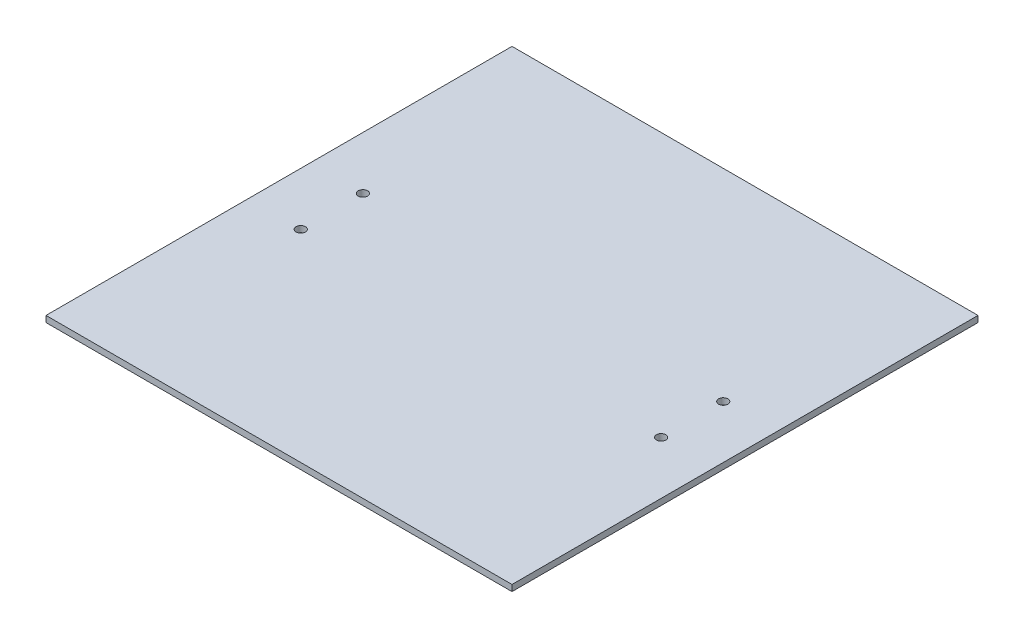
ISO-10303-21;
HEADER;
FILE_DESCRIPTION(('STEP AP214'),'2;1');
FILE_NAME('part.step','',(''),(''),'','','');
FILE_SCHEMA(('AUTOMOTIVE_DESIGN { 1 0 10303 214 1 1 1 1 }'));
ENDSEC;
DATA;
#1=APPLICATION_CONTEXT('core data for automotive mechanical design processes');
#2=APPLICATION_PROTOCOL_DEFINITION('international standard','automotive_design',2000,#1);
#3=PRODUCT_CONTEXT('',#1,'mechanical');
#4=PRODUCT('Part','Part','',(#3));
#5=PRODUCT_RELATED_PRODUCT_CATEGORY('part','',(#4));
#6=PRODUCT_DEFINITION_FORMATION('','',#4);
#7=PRODUCT_DEFINITION_CONTEXT('part definition',#1,'design');
#8=PRODUCT_DEFINITION('design','',#6,#7);
#9=PRODUCT_DEFINITION_SHAPE('','',#8);
#10=(LENGTH_UNIT() NAMED_UNIT(*) SI_UNIT(.MILLI.,.METRE.));
#11=(NAMED_UNIT(*) PLANE_ANGLE_UNIT() SI_UNIT($,.RADIAN.));
#12=(NAMED_UNIT(*) SI_UNIT($,.STERADIAN.) SOLID_ANGLE_UNIT());
#13=UNCERTAINTY_MEASURE_WITH_UNIT(LENGTH_MEASURE(1.E-05),#10,'distance_accuracy_value','');
#14=(GEOMETRIC_REPRESENTATION_CONTEXT(3) GLOBAL_UNCERTAINTY_ASSIGNED_CONTEXT((#13)) GLOBAL_UNIT_ASSIGNED_CONTEXT((#10,
#11,#12)) REPRESENTATION_CONTEXT('',''));
#15=CARTESIAN_POINT('',(0.,0.,0.));
#16=DIRECTION('',(0.,0.,1.));
#17=DIRECTION('',(1.,0.,0.));
#18=AXIS2_PLACEMENT_3D('',#15,#16,#17);
#19=CARTESIAN_POINT('',(0.,2.,0.));
#20=DIRECTION('',(0.,0.,-1.));
#21=DIRECTION('',(-1.,0.,0.));
#22=AXIS2_PLACEMENT_3D('',#19,#20,#21);
#23=PLANE('',#22);
#24=DIRECTION('',(1.,0.,0.));
#25=VECTOR('',#24,1.);
#26=CARTESIAN_POINT('',(0.,0.,0.));
#27=LINE('',#26,#25);
#28=CARTESIAN_POINT('',(0.,0.,0.));
#29=VERTEX_POINT('',#28);
#30=CARTESIAN_POINT('',(150.,0.,0.));
#31=VERTEX_POINT('',#30);
#32=EDGE_CURVE('E113',#29,#31,#27,.T.);
#33=ORIENTED_EDGE('',*,*,#32,.T.);
#34=DIRECTION('',(0.,-1.,0.));
#35=VECTOR('',#34,1.);
#36=CARTESIAN_POINT('',(150.,2.,0.));
#37=LINE('',#36,#35);
#38=CARTESIAN_POINT('',(150.,2.,0.));
#39=VERTEX_POINT('',#38);
#40=EDGE_CURVE('E11',#39,#31,#37,.T.);
#41=ORIENTED_EDGE('',*,*,#40,.F.);
#42=DIRECTION('',(1.,0.,0.));
#43=VECTOR('',#42,1.);
#44=CARTESIAN_POINT('',(0.,2.,0.));
#45=LINE('',#44,#43);
#46=CARTESIAN_POINT('',(0.,2.,0.));
#47=VERTEX_POINT('',#46);
#48=EDGE_CURVE('E87',#47,#39,#45,.T.);
#49=ORIENTED_EDGE('',*,*,#48,.F.);
#50=DIRECTION('',(0.,-1.,0.));
#51=VECTOR('',#50,1.);
#52=CARTESIAN_POINT('',(0.,2.,0.));
#53=LINE('',#52,#51);
#54=EDGE_CURVE('E54',#47,#29,#53,.T.);
#55=ORIENTED_EDGE('',*,*,#54,.T.);
#56=EDGE_LOOP('',(#33,#41,#49,#55));
#57=FACE_BOUND('',#56,.T.);
#58=ADVANCED_FACE('F37',(#57),#23,.F.);
#59=CARTESIAN_POINT('',(150.,2.,0.));
#60=DIRECTION('',(-1.,0.,0.));
#61=DIRECTION('',(0.,0.,1.));
#62=AXIS2_PLACEMENT_3D('',#59,#60,#61);
#63=PLANE('',#62);
#64=DIRECTION('',(0.,0.,-1.));
#65=VECTOR('',#64,1.);
#66=CARTESIAN_POINT('',(150.,0.,0.));
#67=LINE('',#66,#65);
#68=CARTESIAN_POINT('',(150.,0.,-150.));
#69=VERTEX_POINT('',#68);
#70=EDGE_CURVE('E92',#31,#69,#67,.T.);
#71=ORIENTED_EDGE('',*,*,#70,.T.);
#72=DIRECTION('',(0.,-1.,0.));
#73=VECTOR('',#72,1.);
#74=CARTESIAN_POINT('',(150.,2.,-150.));
#75=LINE('',#74,#73);
#76=CARTESIAN_POINT('',(150.,2.,-150.));
#77=VERTEX_POINT('',#76);
#78=EDGE_CURVE('E46',#77,#69,#75,.T.);
#79=ORIENTED_EDGE('',*,*,#78,.F.);
#80=DIRECTION('',(0.,0.,-1.));
#81=VECTOR('',#80,1.);
#82=CARTESIAN_POINT('',(150.,2.,0.));
#83=LINE('',#82,#81);
#84=EDGE_CURVE('E79',#39,#77,#83,.T.);
#85=ORIENTED_EDGE('',*,*,#84,.F.);
#86=ORIENTED_EDGE('',*,*,#40,.T.);
#87=EDGE_LOOP('',(#71,#79,#85,#86));
#88=FACE_BOUND('',#87,.T.);
#89=ADVANCED_FACE('F91',(#88),#63,.F.);
#90=CARTESIAN_POINT('',(0.,2.,-150.));
#91=DIRECTION('',(0.,0.,-1.));
#92=DIRECTION('',(-1.,0.,0.));
#93=AXIS2_PLACEMENT_3D('',#90,#91,#92);
#94=PLANE('',#93);
#95=DIRECTION('',(1.,0.,0.));
#96=VECTOR('',#95,1.);
#97=CARTESIAN_POINT('',(0.,0.,-150.));
#98=LINE('',#97,#96);
#99=CARTESIAN_POINT('',(0.,0.,-150.));
#100=VERTEX_POINT('',#99);
#101=EDGE_CURVE('E116',#100,#69,#98,.T.);
#102=ORIENTED_EDGE('',*,*,#101,.F.);
#103=DIRECTION('',(0.,-1.,0.));
#104=VECTOR('',#103,1.);
#105=CARTESIAN_POINT('',(0.,2.,-150.));
#106=LINE('',#105,#104);
#107=CARTESIAN_POINT('',(0.,2.,-150.));
#108=VERTEX_POINT('',#107);
#109=EDGE_CURVE('E68',#108,#100,#106,.T.);
#110=ORIENTED_EDGE('',*,*,#109,.F.);
#111=DIRECTION('',(1.,0.,0.));
#112=VECTOR('',#111,1.);
#113=CARTESIAN_POINT('',(0.,2.,-150.));
#114=LINE('',#113,#112);
#115=EDGE_CURVE('E86',#108,#77,#114,.T.);
#116=ORIENTED_EDGE('',*,*,#115,.T.);
#117=ORIENTED_EDGE('',*,*,#78,.T.);
#118=EDGE_LOOP('',(#102,#110,#116,#117));
#119=FACE_BOUND('',#118,.T.);
#120=ADVANCED_FACE('F95',(#119),#94,.T.);
#121=CARTESIAN_POINT('',(17.,2.,-85.));
#122=DIRECTION('',(0.,-1.,0.));
#123=DIRECTION('',(0.,0.,-1.));
#124=AXIS2_PLACEMENT_3D('',#121,#122,#123);
#125=CYLINDRICAL_SURFACE('',#124,1.5);
#126=CARTESIAN_POINT('',(17.,2.,-85.));
#127=DIRECTION('',(0.,1.,0.));
#128=DIRECTION('',(0.,0.,1.));
#129=AXIS2_PLACEMENT_3D('',#126,#127,#128);
#130=CIRCLE('',#129,1.5);
#131=CARTESIAN_POINT('',(17.,2.,-83.5));
#132=VERTEX_POINT('',#131);
#133=EDGE_CURVE('E135',#132,#132,#130,.T.);
#134=ORIENTED_EDGE('',*,*,#133,.T.);
#135=EDGE_LOOP('',(#134));
#136=FACE_BOUND('',#135,.T.);
#137=CARTESIAN_POINT('',(17.,0.,-85.));
#138=DIRECTION('',(0.,1.,0.));
#139=DIRECTION('',(0.,0.,1.));
#140=AXIS2_PLACEMENT_3D('',#137,#138,#139);
#141=CIRCLE('',#140,1.5);
#142=CARTESIAN_POINT('',(17.,0.,-83.5));
#143=VERTEX_POINT('',#142);
#144=EDGE_CURVE('E110',#143,#143,#141,.T.);
#145=ORIENTED_EDGE('',*,*,#144,.F.);
#146=EDGE_LOOP('',(#145));
#147=FACE_BOUND('',#146,.T.);
#148=ADVANCED_FACE('F139',(#136,#147),#125,.F.);
#149=CARTESIAN_POINT('',(133.,2.,-85.));
#150=DIRECTION('',(0.,-1.,0.));
#151=DIRECTION('',(0.,0.,-1.));
#152=AXIS2_PLACEMENT_3D('',#149,#150,#151);
#153=CYLINDRICAL_SURFACE('',#152,1.50000000000003);
#154=CARTESIAN_POINT('',(133.,2.,-85.));
#155=DIRECTION('',(0.,1.,0.));
#156=DIRECTION('',(0.,0.,1.));
#157=AXIS2_PLACEMENT_3D('',#154,#155,#156);
#158=CIRCLE('',#157,1.50000000000003);
#159=CARTESIAN_POINT('',(133.,2.,-83.5));
#160=VERTEX_POINT('',#159);
#161=EDGE_CURVE('E130',#160,#160,#158,.T.);
#162=ORIENTED_EDGE('',*,*,#161,.T.);
#163=EDGE_LOOP('',(#162));
#164=FACE_BOUND('',#163,.T.);
#165=CARTESIAN_POINT('',(133.,0.,-85.));
#166=DIRECTION('',(0.,1.,0.));
#167=DIRECTION('',(0.,0.,1.));
#168=AXIS2_PLACEMENT_3D('',#165,#166,#167);
#169=CIRCLE('',#168,1.50000000000003);
#170=CARTESIAN_POINT('',(133.,0.,-83.5));
#171=VERTEX_POINT('',#170);
#172=EDGE_CURVE('E107',#171,#171,#169,.T.);
#173=ORIENTED_EDGE('',*,*,#172,.F.);
#174=EDGE_LOOP('',(#173));
#175=FACE_BOUND('',#174,.T.);
#176=ADVANCED_FACE('F165',(#164,#175),#153,.F.);
#177=CARTESIAN_POINT('',(17.,2.,-65.));
#178=DIRECTION('',(0.,-1.,0.));
#179=DIRECTION('',(0.,0.,-1.));
#180=AXIS2_PLACEMENT_3D('',#177,#178,#179);
#181=CYLINDRICAL_SURFACE('',#180,1.5);
#182=CARTESIAN_POINT('',(17.,2.,-65.));
#183=DIRECTION('',(0.,1.,0.));
#184=DIRECTION('',(0.,0.,1.));
#185=AXIS2_PLACEMENT_3D('',#182,#183,#184);
#186=CIRCLE('',#185,1.5);
#187=CARTESIAN_POINT('',(17.,2.,-63.5));
#188=VERTEX_POINT('',#187);
#189=EDGE_CURVE('E125',#188,#188,#186,.T.);
#190=ORIENTED_EDGE('',*,*,#189,.T.);
#191=EDGE_LOOP('',(#190));
#192=FACE_BOUND('',#191,.T.);
#193=CARTESIAN_POINT('',(17.,0.,-65.));
#194=DIRECTION('',(0.,1.,0.));
#195=DIRECTION('',(0.,0.,1.));
#196=AXIS2_PLACEMENT_3D('',#193,#194,#195);
#197=CIRCLE('',#196,1.5);
#198=CARTESIAN_POINT('',(17.,0.,-63.5));
#199=VERTEX_POINT('',#198);
#200=EDGE_CURVE('E104',#199,#199,#197,.T.);
#201=ORIENTED_EDGE('',*,*,#200,.F.);
#202=EDGE_LOOP('',(#201));
#203=FACE_BOUND('',#202,.T.);
#204=ADVANCED_FACE('F167',(#192,#203),#181,.F.);
#205=CARTESIAN_POINT('',(133.,2.,-65.));
#206=DIRECTION('',(0.,-1.,0.));
#207=DIRECTION('',(0.,0.,-1.));
#208=AXIS2_PLACEMENT_3D('',#205,#206,#207);
#209=CYLINDRICAL_SURFACE('',#208,1.50000000000003);
#210=CARTESIAN_POINT('',(133.,2.,-65.));
#211=DIRECTION('',(0.,1.,0.));
#212=DIRECTION('',(0.,0.,1.));
#213=AXIS2_PLACEMENT_3D('',#210,#211,#212);
#214=CIRCLE('',#213,1.50000000000003);
#215=CARTESIAN_POINT('',(133.,2.,-63.5));
#216=VERTEX_POINT('',#215);
#217=EDGE_CURVE('E121',#216,#216,#214,.T.);
#218=ORIENTED_EDGE('',*,*,#217,.T.);
#219=EDGE_LOOP('',(#218));
#220=FACE_BOUND('',#219,.T.);
#221=CARTESIAN_POINT('',(133.,0.,-65.));
#222=DIRECTION('',(0.,1.,0.));
#223=DIRECTION('',(0.,0.,1.));
#224=AXIS2_PLACEMENT_3D('',#221,#222,#223);
#225=CIRCLE('',#224,1.50000000000003);
#226=CARTESIAN_POINT('',(133.,0.,-63.5));
#227=VERTEX_POINT('',#226);
#228=EDGE_CURVE('E101',#227,#227,#225,.T.);
#229=ORIENTED_EDGE('',*,*,#228,.F.);
#230=EDGE_LOOP('',(#229));
#231=FACE_BOUND('',#230,.T.);
#232=ADVANCED_FACE('F39',(#220,#231),#209,.F.);
#233=CARTESIAN_POINT('',(0.,2.,0.));
#234=DIRECTION('',(-1.,0.,0.));
#235=DIRECTION('',(0.,0.,1.));
#236=AXIS2_PLACEMENT_3D('',#233,#234,#235);
#237=PLANE('',#236);
#238=DIRECTION('',(0.,0.,-1.));
#239=VECTOR('',#238,1.);
#240=CARTESIAN_POINT('',(0.,0.,0.));
#241=LINE('',#240,#239);
#242=EDGE_CURVE('E118',#29,#100,#241,.T.);
#243=ORIENTED_EDGE('',*,*,#242,.F.);
#244=ORIENTED_EDGE('',*,*,#54,.F.);
#245=DIRECTION('',(0.,0.,-1.));
#246=VECTOR('',#245,1.);
#247=CARTESIAN_POINT('',(0.,2.,0.));
#248=LINE('',#247,#246);
#249=EDGE_CURVE('E96',#47,#108,#248,.T.);
#250=ORIENTED_EDGE('',*,*,#249,.T.);
#251=ORIENTED_EDGE('',*,*,#109,.T.);
#252=EDGE_LOOP('',(#243,#244,#250,#251));
#253=FACE_BOUND('',#252,.T.);
#254=ADVANCED_FACE('F144',(#253),#237,.T.);
#255=CARTESIAN_POINT('',(0.,2.,0.));
#256=DIRECTION('',(0.,1.,0.));
#257=DIRECTION('',(0.,0.,1.));
#258=AXIS2_PLACEMENT_3D('',#255,#256,#257);
#259=PLANE('',#258);
#260=ORIENTED_EDGE('',*,*,#217,.F.);
#261=EDGE_LOOP('',(#260));
#262=FACE_BOUND('',#261,.T.);
#263=ORIENTED_EDGE('',*,*,#189,.F.);
#264=EDGE_LOOP('',(#263));
#265=FACE_BOUND('',#264,.T.);
#266=ORIENTED_EDGE('',*,*,#161,.F.);
#267=EDGE_LOOP('',(#266));
#268=FACE_BOUND('',#267,.T.);
#269=ORIENTED_EDGE('',*,*,#133,.F.);
#270=EDGE_LOOP('',(#269));
#271=FACE_BOUND('',#270,.T.);
#272=ORIENTED_EDGE('',*,*,#48,.T.);
#273=ORIENTED_EDGE('',*,*,#84,.T.);
#274=ORIENTED_EDGE('',*,*,#115,.F.);
#275=ORIENTED_EDGE('',*,*,#249,.F.);
#276=EDGE_LOOP('',(#272,#273,#274,#275));
#277=FACE_BOUND('',#276,.T.);
#278=ADVANCED_FACE('F83',(#262,#265,#268,#271,#277),#259,.T.);
#279=CARTESIAN_POINT('',(0.,0.,0.));
#280=DIRECTION('',(0.,1.,0.));
#281=DIRECTION('',(0.,0.,1.));
#282=AXIS2_PLACEMENT_3D('',#279,#280,#281);
#283=PLANE('',#282);
#284=ORIENTED_EDGE('',*,*,#228,.T.);
#285=EDGE_LOOP('',(#284));
#286=FACE_BOUND('',#285,.T.);
#287=ORIENTED_EDGE('',*,*,#200,.T.);
#288=EDGE_LOOP('',(#287));
#289=FACE_BOUND('',#288,.T.);
#290=ORIENTED_EDGE('',*,*,#172,.T.);
#291=EDGE_LOOP('',(#290));
#292=FACE_BOUND('',#291,.T.);
#293=ORIENTED_EDGE('',*,*,#144,.T.);
#294=EDGE_LOOP('',(#293));
#295=FACE_BOUND('',#294,.T.);
#296=ORIENTED_EDGE('',*,*,#32,.F.);
#297=ORIENTED_EDGE('',*,*,#242,.T.);
#298=ORIENTED_EDGE('',*,*,#101,.T.);
#299=ORIENTED_EDGE('',*,*,#70,.F.);
#300=EDGE_LOOP('',(#296,#297,#298,#299));
#301=FACE_BOUND('',#300,.T.);
#302=ADVANCED_FACE('F143',(#286,#289,#292,#295,#301),#283,.F.);
#303=CLOSED_SHELL('',(#58,#89,#120,#148,#176,#204,#232,#254,#278,#302));
#304=MANIFOLD_SOLID_BREP('B2',#303);
#305=ADVANCED_BREP_SHAPE_REPRESENTATION('',(#18,#304),#14);
#306=SHAPE_DEFINITION_REPRESENTATION(#9,#305);
ENDSEC;
END-ISO-10303-21;
